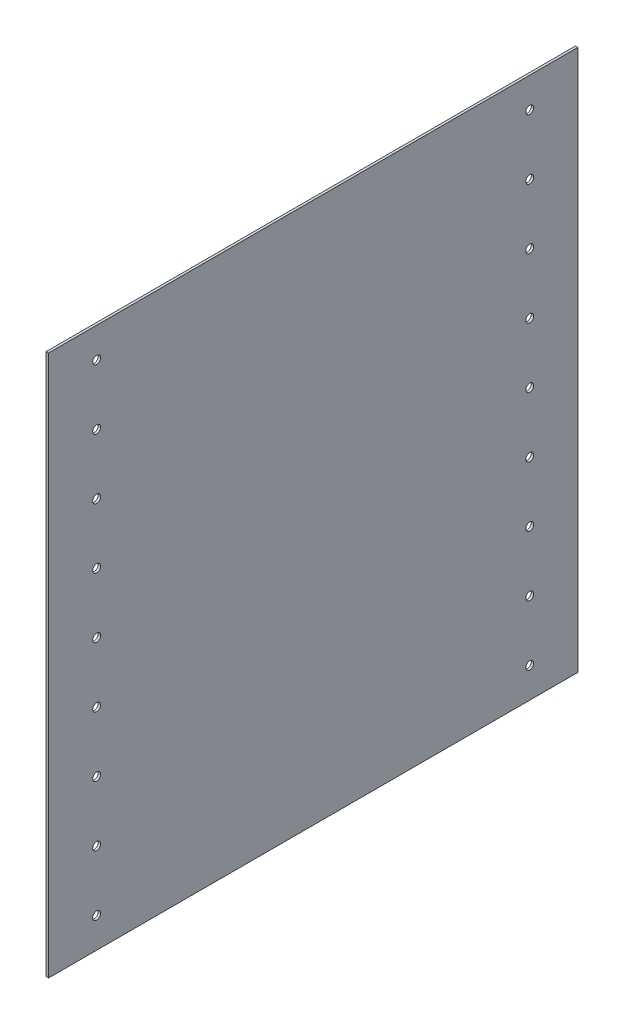
ISO-10303-21;
HEADER;
FILE_DESCRIPTION(('STEP AP214'),'2;1');
FILE_NAME('part.step','',(''),(''),'','','');
FILE_SCHEMA(('AUTOMOTIVE_DESIGN { 1 0 10303 214 1 1 1 1 }'));
ENDSEC;
DATA;
#1=APPLICATION_CONTEXT('core data for automotive mechanical design processes');
#2=APPLICATION_PROTOCOL_DEFINITION('international standard','automotive_design',2000,#1);
#3=PRODUCT_CONTEXT('',#1,'mechanical');
#4=PRODUCT('Part','Part','',(#3));
#5=PRODUCT_RELATED_PRODUCT_CATEGORY('part','',(#4));
#6=PRODUCT_DEFINITION_FORMATION('','',#4);
#7=PRODUCT_DEFINITION_CONTEXT('part definition',#1,'design');
#8=PRODUCT_DEFINITION('design','',#6,#7);
#9=PRODUCT_DEFINITION_SHAPE('','',#8);
#10=(LENGTH_UNIT() NAMED_UNIT(*) SI_UNIT(.MILLI.,.METRE.));
#11=(NAMED_UNIT(*) PLANE_ANGLE_UNIT() SI_UNIT($,.RADIAN.));
#12=(NAMED_UNIT(*) SI_UNIT($,.STERADIAN.) SOLID_ANGLE_UNIT());
#13=UNCERTAINTY_MEASURE_WITH_UNIT(LENGTH_MEASURE(1.E-05),#10,'distance_accuracy_value','');
#14=(GEOMETRIC_REPRESENTATION_CONTEXT(3) GLOBAL_UNCERTAINTY_ASSIGNED_CONTEXT((#13)) GLOBAL_UNIT_ASSIGNED_CONTEXT((#10,
#11,#12)) REPRESENTATION_CONTEXT('',''));
#15=CARTESIAN_POINT('',(0.,0.,0.));
#16=DIRECTION('',(0.,0.,1.));
#17=DIRECTION('',(1.,0.,0.));
#18=AXIS2_PLACEMENT_3D('',#15,#16,#17);
#19=CARTESIAN_POINT('',(2.,0.,440.));
#20=DIRECTION('',(-1.,0.,0.));
#21=DIRECTION('',(0.,0.,1.));
#22=AXIS2_PLACEMENT_3D('',#19,#20,#21);
#23=PLANE('',#22);
#24=CARTESIAN_POINT('',(2.,425.,400.));
#25=DIRECTION('',(1.,0.,0.));
#26=DIRECTION('',(0.,0.,-1.));
#27=AXIS2_PLACEMENT_3D('',#24,#25,#26);
#28=CIRCLE('',#27,3.30000000000003);
#29=CARTESIAN_POINT('',(2.,425.,396.7));
#30=VERTEX_POINT('',#29);
#31=EDGE_CURVE('E185',#30,#30,#28,.T.);
#32=ORIENTED_EDGE('',*,*,#31,.F.);
#33=EDGE_LOOP('',(#32));
#34=FACE_BOUND('',#33,.T.);
#35=DIRECTION('',(0.,1.,0.));
#36=VECTOR('',#35,1.);
#37=CARTESIAN_POINT('',(2.,0.,0.));
#38=LINE('',#37,#36);
#39=CARTESIAN_POINT('',(2.,0.,0.));
#40=VERTEX_POINT('',#39);
#41=CARTESIAN_POINT('',(2.,450.,0.));
#42=VERTEX_POINT('',#41);
#43=EDGE_CURVE('E102',#40,#42,#38,.T.);
#44=ORIENTED_EDGE('',*,*,#43,.T.);
#45=DIRECTION('',(0.,0.,-1.));
#46=VECTOR('',#45,1.);
#47=CARTESIAN_POINT('',(2.,450.,440.));
#48=LINE('',#47,#46);
#49=CARTESIAN_POINT('',(2.,450.,440.));
#50=VERTEX_POINT('',#49);
#51=EDGE_CURVE('E11',#50,#42,#48,.T.);
#52=ORIENTED_EDGE('',*,*,#51,.F.);
#53=DIRECTION('',(0.,1.,0.));
#54=VECTOR('',#53,1.);
#55=CARTESIAN_POINT('',(2.,0.,440.));
#56=LINE('',#55,#54);
#57=CARTESIAN_POINT('',(2.,0.,440.));
#58=VERTEX_POINT('',#57);
#59=EDGE_CURVE('E78',#58,#50,#56,.T.);
#60=ORIENTED_EDGE('',*,*,#59,.F.);
#61=DIRECTION('',(0.,0.,-1.));
#62=VECTOR('',#61,1.);
#63=CARTESIAN_POINT('',(2.,0.,440.));
#64=LINE('',#63,#62);
#65=EDGE_CURVE('E54',#58,#40,#64,.T.);
#66=ORIENTED_EDGE('',*,*,#65,.T.);
#67=EDGE_LOOP('',(#44,#52,#60,#66));
#68=FACE_BOUND('',#67,.T.);
#69=CARTESIAN_POINT('',(2.,425.,40.));
#70=DIRECTION('',(1.,0.,0.));
#71=DIRECTION('',(0.,0.,-1.));
#72=AXIS2_PLACEMENT_3D('',#69,#70,#71);
#73=CIRCLE('',#72,3.30000000000003);
#74=CARTESIAN_POINT('',(2.,425.,36.7));
#75=VERTEX_POINT('',#74);
#76=EDGE_CURVE('E116',#75,#75,#73,.T.);
#77=ORIENTED_EDGE('',*,*,#76,.F.);
#78=EDGE_LOOP('',(#77));
#79=FACE_BOUND('',#78,.T.);
#80=CARTESIAN_POINT('',(2.,375.,40.0000000000005));
#81=DIRECTION('',(1.,0.,0.));
#82=DIRECTION('',(0.,0.,-1.));
#83=AXIS2_PLACEMENT_3D('',#80,#81,#82);
#84=CIRCLE('',#83,3.30000000000003);
#85=CARTESIAN_POINT('',(2.,375.,36.7000000000005));
#86=VERTEX_POINT('',#85);
#87=EDGE_CURVE('E117',#86,#86,#84,.T.);
#88=ORIENTED_EDGE('',*,*,#87,.F.);
#89=EDGE_LOOP('',(#88));
#90=FACE_BOUND('',#89,.T.);
#91=CARTESIAN_POINT('',(2.,325.,40.0000000000009));
#92=DIRECTION('',(1.,0.,0.));
#93=DIRECTION('',(0.,0.,-1.));
#94=AXIS2_PLACEMENT_3D('',#91,#92,#93);
#95=CIRCLE('',#94,3.30000000000003);
#96=CARTESIAN_POINT('',(2.,325.,36.7000000000009));
#97=VERTEX_POINT('',#96);
#98=EDGE_CURVE('E121',#97,#97,#95,.T.);
#99=ORIENTED_EDGE('',*,*,#98,.F.);
#100=EDGE_LOOP('',(#99));
#101=FACE_BOUND('',#100,.T.);
#102=CARTESIAN_POINT('',(2.,275.,40.0000000000014));
#103=DIRECTION('',(1.,0.,0.));
#104=DIRECTION('',(0.,0.,-1.));
#105=AXIS2_PLACEMENT_3D('',#102,#103,#104);
#106=CIRCLE('',#105,3.30000000000003);
#107=CARTESIAN_POINT('',(2.,275.,36.7000000000014));
#108=VERTEX_POINT('',#107);
#109=EDGE_CURVE('E125',#108,#108,#106,.T.);
#110=ORIENTED_EDGE('',*,*,#109,.F.);
#111=EDGE_LOOP('',(#110));
#112=FACE_BOUND('',#111,.T.);
#113=CARTESIAN_POINT('',(2.,225.,40.0000000000019));
#114=DIRECTION('',(1.,0.,0.));
#115=DIRECTION('',(0.,0.,-1.));
#116=AXIS2_PLACEMENT_3D('',#113,#114,#115);
#117=CIRCLE('',#116,3.3);
#118=CARTESIAN_POINT('',(2.,225.,36.7000000000019));
#119=VERTEX_POINT('',#118);
#120=EDGE_CURVE('E129',#119,#119,#117,.T.);
#121=ORIENTED_EDGE('',*,*,#120,.F.);
#122=EDGE_LOOP('',(#121));
#123=FACE_BOUND('',#122,.T.);
#124=CARTESIAN_POINT('',(2.,175.,40.0000000000024));
#125=DIRECTION('',(1.,0.,0.));
#126=DIRECTION('',(0.,0.,-1.));
#127=AXIS2_PLACEMENT_3D('',#124,#125,#126);
#128=CIRCLE('',#127,3.3);
#129=CARTESIAN_POINT('',(2.,175.,36.7000000000024));
#130=VERTEX_POINT('',#129);
#131=EDGE_CURVE('E133',#130,#130,#128,.T.);
#132=ORIENTED_EDGE('',*,*,#131,.F.);
#133=EDGE_LOOP('',(#132));
#134=FACE_BOUND('',#133,.T.);
#135=CARTESIAN_POINT('',(2.,125.,40.0000000000029));
#136=DIRECTION('',(1.,0.,0.));
#137=DIRECTION('',(0.,0.,-1.));
#138=AXIS2_PLACEMENT_3D('',#135,#136,#137);
#139=CIRCLE('',#138,3.3);
#140=CARTESIAN_POINT('',(2.,125.,36.7000000000029));
#141=VERTEX_POINT('',#140);
#142=EDGE_CURVE('E137',#141,#141,#139,.T.);
#143=ORIENTED_EDGE('',*,*,#142,.F.);
#144=EDGE_LOOP('',(#143));
#145=FACE_BOUND('',#144,.T.);
#146=CARTESIAN_POINT('',(2.,75.0000000000001,40.0000000000034));
#147=DIRECTION('',(1.,0.,0.));
#148=DIRECTION('',(0.,0.,-1.));
#149=AXIS2_PLACEMENT_3D('',#146,#147,#148);
#150=CIRCLE('',#149,3.3);
#151=CARTESIAN_POINT('',(2.,75.0000000000001,36.7000000000034));
#152=VERTEX_POINT('',#151);
#153=EDGE_CURVE('E141',#152,#152,#150,.T.);
#154=ORIENTED_EDGE('',*,*,#153,.F.);
#155=EDGE_LOOP('',(#154));
#156=FACE_BOUND('',#155,.T.);
#157=CARTESIAN_POINT('',(2.,25.0000000000001,40.000000000004));
#158=DIRECTION('',(1.,0.,0.));
#159=DIRECTION('',(0.,0.,-1.));
#160=AXIS2_PLACEMENT_3D('',#157,#158,#159);
#161=CIRCLE('',#160,3.3);
#162=CARTESIAN_POINT('',(2.,25.0000000000001,36.700000000004));
#163=VERTEX_POINT('',#162);
#164=EDGE_CURVE('E145',#163,#163,#161,.T.);
#165=ORIENTED_EDGE('',*,*,#164,.F.);
#166=EDGE_LOOP('',(#165));
#167=FACE_BOUND('',#166,.T.);
#168=CARTESIAN_POINT('',(2.,25.0000000000001,399.999999999996));
#169=DIRECTION('',(1.,0.,0.));
#170=DIRECTION('',(0.,0.,-1.));
#171=AXIS2_PLACEMENT_3D('',#168,#169,#170);
#172=CIRCLE('',#171,3.3);
#173=CARTESIAN_POINT('',(2.,25.0000000000001,396.699999999996));
#174=VERTEX_POINT('',#173);
#175=EDGE_CURVE('E149',#174,#174,#172,.T.);
#176=ORIENTED_EDGE('',*,*,#175,.F.);
#177=EDGE_LOOP('',(#176));
#178=FACE_BOUND('',#177,.T.);
#179=CARTESIAN_POINT('',(2.,75.0000000000001,399.999999999997));
#180=DIRECTION('',(1.,0.,0.));
#181=DIRECTION('',(0.,0.,-1.));
#182=AXIS2_PLACEMENT_3D('',#179,#180,#181);
#183=CIRCLE('',#182,3.3);
#184=CARTESIAN_POINT('',(2.,75.0000000000001,396.699999999997));
#185=VERTEX_POINT('',#184);
#186=EDGE_CURVE('E153',#185,#185,#183,.T.);
#187=ORIENTED_EDGE('',*,*,#186,.F.);
#188=EDGE_LOOP('',(#187));
#189=FACE_BOUND('',#188,.T.);
#190=CARTESIAN_POINT('',(2.,125.,399.999999999997));
#191=DIRECTION('',(1.,0.,0.));
#192=DIRECTION('',(0.,0.,-1.));
#193=AXIS2_PLACEMENT_3D('',#190,#191,#192);
#194=CIRCLE('',#193,3.3);
#195=CARTESIAN_POINT('',(2.,125.,396.699999999997));
#196=VERTEX_POINT('',#195);
#197=EDGE_CURVE('E157',#196,#196,#194,.T.);
#198=ORIENTED_EDGE('',*,*,#197,.F.);
#199=EDGE_LOOP('',(#198));
#200=FACE_BOUND('',#199,.T.);
#201=CARTESIAN_POINT('',(2.,175.,399.999999999997));
#202=DIRECTION('',(1.,0.,0.));
#203=DIRECTION('',(0.,0.,-1.));
#204=AXIS2_PLACEMENT_3D('',#201,#202,#203);
#205=CIRCLE('',#204,3.3);
#206=CARTESIAN_POINT('',(2.,175.,396.699999999997));
#207=VERTEX_POINT('',#206);
#208=EDGE_CURVE('E161',#207,#207,#205,.T.);
#209=ORIENTED_EDGE('',*,*,#208,.F.);
#210=EDGE_LOOP('',(#209));
#211=FACE_BOUND('',#210,.T.);
#212=CARTESIAN_POINT('',(2.,225.,399.999999999998));
#213=DIRECTION('',(1.,0.,0.));
#214=DIRECTION('',(0.,0.,-1.));
#215=AXIS2_PLACEMENT_3D('',#212,#213,#214);
#216=CIRCLE('',#215,3.3);
#217=CARTESIAN_POINT('',(2.,225.,396.699999999998));
#218=VERTEX_POINT('',#217);
#219=EDGE_CURVE('E165',#218,#218,#216,.T.);
#220=ORIENTED_EDGE('',*,*,#219,.F.);
#221=EDGE_LOOP('',(#220));
#222=FACE_BOUND('',#221,.T.);
#223=CARTESIAN_POINT('',(2.,275.,399.999999999999));
#224=DIRECTION('',(1.,0.,0.));
#225=DIRECTION('',(0.,0.,-1.));
#226=AXIS2_PLACEMENT_3D('',#223,#224,#225);
#227=CIRCLE('',#226,3.30000000000003);
#228=CARTESIAN_POINT('',(2.,275.,396.699999999999));
#229=VERTEX_POINT('',#228);
#230=EDGE_CURVE('E169',#229,#229,#227,.T.);
#231=ORIENTED_EDGE('',*,*,#230,.F.);
#232=EDGE_LOOP('',(#231));
#233=FACE_BOUND('',#232,.T.);
#234=CARTESIAN_POINT('',(2.,325.,399.999999999999));
#235=DIRECTION('',(1.,0.,0.));
#236=DIRECTION('',(0.,0.,-1.));
#237=AXIS2_PLACEMENT_3D('',#234,#235,#236);
#238=CIRCLE('',#237,3.30000000000003);
#239=CARTESIAN_POINT('',(2.,325.,396.699999999999));
#240=VERTEX_POINT('',#239);
#241=EDGE_CURVE('E172',#240,#240,#238,.T.);
#242=ORIENTED_EDGE('',*,*,#241,.F.);
#243=EDGE_LOOP('',(#242));
#244=FACE_BOUND('',#243,.T.);
#245=CARTESIAN_POINT('',(2.,375.,400.));
#246=DIRECTION('',(1.,0.,0.));
#247=DIRECTION('',(0.,0.,-1.));
#248=AXIS2_PLACEMENT_3D('',#245,#246,#247);
#249=CIRCLE('',#248,3.30000000000003);
#250=CARTESIAN_POINT('',(2.,375.,396.699999999999));
#251=VERTEX_POINT('',#250);
#252=EDGE_CURVE('E175',#251,#251,#249,.T.);
#253=ORIENTED_EDGE('',*,*,#252,.F.);
#254=EDGE_LOOP('',(#253));
#255=FACE_BOUND('',#254,.T.);
#256=ADVANCED_FACE('F36',(#34,#68,#79,#90,#101,#112,#123,#134,#145,#156,#167,#178,#189,#200,
#211,#222,#233,#244,#255),#23,.F.);
#257=CARTESIAN_POINT('',(0.,450.,440.));
#258=DIRECTION('',(0.,1.,0.));
#259=DIRECTION('',(0.,0.,1.));
#260=AXIS2_PLACEMENT_3D('',#257,#258,#259);
#261=PLANE('',#260);
#262=DIRECTION('',(1.,0.,0.));
#263=VECTOR('',#262,1.);
#264=CARTESIAN_POINT('',(0.,450.,0.));
#265=LINE('',#264,#263);
#266=CARTESIAN_POINT('',(0.,450.,0.));
#267=VERTEX_POINT('',#266);
#268=EDGE_CURVE('E87',#267,#42,#265,.T.);
#269=ORIENTED_EDGE('',*,*,#268,.F.);
#270=DIRECTION('',(0.,0.,-1.));
#271=VECTOR('',#270,1.);
#272=CARTESIAN_POINT('',(0.,450.,440.));
#273=LINE('',#272,#271);
#274=CARTESIAN_POINT('',(0.,450.,440.));
#275=VERTEX_POINT('',#274);
#276=EDGE_CURVE('E45',#275,#267,#273,.T.);
#277=ORIENTED_EDGE('',*,*,#276,.F.);
#278=DIRECTION('',(1.,0.,0.));
#279=VECTOR('',#278,1.);
#280=CARTESIAN_POINT('',(0.,450.,440.));
#281=LINE('',#280,#279);
#282=EDGE_CURVE('E85',#275,#50,#281,.T.);
#283=ORIENTED_EDGE('',*,*,#282,.T.);
#284=ORIENTED_EDGE('',*,*,#51,.T.);
#285=EDGE_LOOP('',(#269,#277,#283,#284));
#286=FACE_BOUND('',#285,.T.);
#287=ADVANCED_FACE('F84',(#286),#261,.T.);
#288=CARTESIAN_POINT('',(0.,0.,440.));
#289=DIRECTION('',(-1.,0.,0.));
#290=DIRECTION('',(0.,0.,1.));
#291=AXIS2_PLACEMENT_3D('',#288,#289,#290);
#292=PLANE('',#291);
#293=CARTESIAN_POINT('',(0.,425.,400.));
#294=DIRECTION('',(-1.,0.,0.));
#295=DIRECTION('',(0.,0.,1.));
#296=AXIS2_PLACEMENT_3D('',#293,#294,#295);
#297=CIRCLE('',#296,3.30000000000003);
#298=CARTESIAN_POINT('',(0.,425.,403.3));
#299=VERTEX_POINT('',#298);
#300=EDGE_CURVE('E39',#299,#299,#297,.T.);
#301=ORIENTED_EDGE('',*,*,#300,.F.);
#302=EDGE_LOOP('',(#301));
#303=FACE_BOUND('',#302,.T.);
#304=CARTESIAN_POINT('',(0.,375.,400.));
#305=DIRECTION('',(-1.,0.,0.));
#306=DIRECTION('',(0.,0.,1.));
#307=AXIS2_PLACEMENT_3D('',#304,#305,#306);
#308=CIRCLE('',#307,3.30000000000003);
#309=CARTESIAN_POINT('',(0.,375.,403.3));
#310=VERTEX_POINT('',#309);
#311=EDGE_CURVE('E173',#310,#310,#308,.T.);
#312=ORIENTED_EDGE('',*,*,#311,.F.);
#313=EDGE_LOOP('',(#312));
#314=FACE_BOUND('',#313,.T.);
#315=CARTESIAN_POINT('',(0.,325.,399.999999999999));
#316=DIRECTION('',(-1.,0.,0.));
#317=DIRECTION('',(0.,0.,1.));
#318=AXIS2_PLACEMENT_3D('',#315,#316,#317);
#319=CIRCLE('',#318,3.30000000000003);
#320=CARTESIAN_POINT('',(0.,325.,403.299999999999));
#321=VERTEX_POINT('',#320);
#322=EDGE_CURVE('E170',#321,#321,#319,.T.);
#323=ORIENTED_EDGE('',*,*,#322,.F.);
#324=EDGE_LOOP('',(#323));
#325=FACE_BOUND('',#324,.T.);
#326=CARTESIAN_POINT('',(0.,275.,399.999999999999));
#327=DIRECTION('',(-1.,0.,0.));
#328=DIRECTION('',(0.,0.,1.));
#329=AXIS2_PLACEMENT_3D('',#326,#327,#328);
#330=CIRCLE('',#329,3.30000000000003);
#331=CARTESIAN_POINT('',(0.,275.,403.299999999999));
#332=VERTEX_POINT('',#331);
#333=EDGE_CURVE('E166',#332,#332,#330,.T.);
#334=ORIENTED_EDGE('',*,*,#333,.F.);
#335=EDGE_LOOP('',(#334));
#336=FACE_BOUND('',#335,.T.);
#337=CARTESIAN_POINT('',(0.,225.,399.999999999998));
#338=DIRECTION('',(-1.,0.,0.));
#339=DIRECTION('',(0.,0.,1.));
#340=AXIS2_PLACEMENT_3D('',#337,#338,#339);
#341=CIRCLE('',#340,3.3);
#342=CARTESIAN_POINT('',(0.,225.,403.299999999998));
#343=VERTEX_POINT('',#342);
#344=EDGE_CURVE('E162',#343,#343,#341,.T.);
#345=ORIENTED_EDGE('',*,*,#344,.F.);
#346=EDGE_LOOP('',(#345));
#347=FACE_BOUND('',#346,.T.);
#348=CARTESIAN_POINT('',(0.,175.,399.999999999997));
#349=DIRECTION('',(-1.,0.,0.));
#350=DIRECTION('',(0.,0.,1.));
#351=AXIS2_PLACEMENT_3D('',#348,#349,#350);
#352=CIRCLE('',#351,3.3);
#353=CARTESIAN_POINT('',(0.,175.,403.299999999998));
#354=VERTEX_POINT('',#353);
#355=EDGE_CURVE('E158',#354,#354,#352,.T.);
#356=ORIENTED_EDGE('',*,*,#355,.F.);
#357=EDGE_LOOP('',(#356));
#358=FACE_BOUND('',#357,.T.);
#359=CARTESIAN_POINT('',(0.,125.,399.999999999997));
#360=DIRECTION('',(-1.,0.,0.));
#361=DIRECTION('',(0.,0.,1.));
#362=AXIS2_PLACEMENT_3D('',#359,#360,#361);
#363=CIRCLE('',#362,3.3);
#364=CARTESIAN_POINT('',(0.,125.,403.299999999997));
#365=VERTEX_POINT('',#364);
#366=EDGE_CURVE('E154',#365,#365,#363,.T.);
#367=ORIENTED_EDGE('',*,*,#366,.F.);
#368=EDGE_LOOP('',(#367));
#369=FACE_BOUND('',#368,.T.);
#370=CARTESIAN_POINT('',(0.,75.0000000000001,399.999999999997));
#371=DIRECTION('',(-1.,0.,0.));
#372=DIRECTION('',(0.,0.,1.));
#373=AXIS2_PLACEMENT_3D('',#370,#371,#372);
#374=CIRCLE('',#373,3.3);
#375=CARTESIAN_POINT('',(0.,75.0000000000001,403.299999999997));
#376=VERTEX_POINT('',#375);
#377=EDGE_CURVE('E150',#376,#376,#374,.T.);
#378=ORIENTED_EDGE('',*,*,#377,.F.);
#379=EDGE_LOOP('',(#378));
#380=FACE_BOUND('',#379,.T.);
#381=CARTESIAN_POINT('',(0.,25.0000000000001,399.999999999996));
#382=DIRECTION('',(-1.,0.,0.));
#383=DIRECTION('',(0.,0.,1.));
#384=AXIS2_PLACEMENT_3D('',#381,#382,#383);
#385=CIRCLE('',#384,3.3);
#386=CARTESIAN_POINT('',(0.,25.0000000000001,403.299999999996));
#387=VERTEX_POINT('',#386);
#388=EDGE_CURVE('E146',#387,#387,#385,.T.);
#389=ORIENTED_EDGE('',*,*,#388,.F.);
#390=EDGE_LOOP('',(#389));
#391=FACE_BOUND('',#390,.T.);
#392=CARTESIAN_POINT('',(0.,25.0000000000001,40.000000000004));
#393=DIRECTION('',(-1.,0.,0.));
#394=DIRECTION('',(0.,0.,1.));
#395=AXIS2_PLACEMENT_3D('',#392,#393,#394);
#396=CIRCLE('',#395,3.3);
#397=CARTESIAN_POINT('',(0.,25.0000000000001,43.300000000004));
#398=VERTEX_POINT('',#397);
#399=EDGE_CURVE('E142',#398,#398,#396,.T.);
#400=ORIENTED_EDGE('',*,*,#399,.F.);
#401=EDGE_LOOP('',(#400));
#402=FACE_BOUND('',#401,.T.);
#403=CARTESIAN_POINT('',(0.,75.0000000000001,40.0000000000034));
#404=DIRECTION('',(-1.,0.,0.));
#405=DIRECTION('',(0.,0.,1.));
#406=AXIS2_PLACEMENT_3D('',#403,#404,#405);
#407=CIRCLE('',#406,3.3);
#408=CARTESIAN_POINT('',(0.,75.0000000000001,43.3000000000034));
#409=VERTEX_POINT('',#408);
#410=EDGE_CURVE('E138',#409,#409,#407,.T.);
#411=ORIENTED_EDGE('',*,*,#410,.F.);
#412=EDGE_LOOP('',(#411));
#413=FACE_BOUND('',#412,.T.);
#414=CARTESIAN_POINT('',(0.,125.,40.0000000000029));
#415=DIRECTION('',(-1.,0.,0.));
#416=DIRECTION('',(0.,0.,1.));
#417=AXIS2_PLACEMENT_3D('',#414,#415,#416);
#418=CIRCLE('',#417,3.3);
#419=CARTESIAN_POINT('',(0.,125.,43.3000000000029));
#420=VERTEX_POINT('',#419);
#421=EDGE_CURVE('E134',#420,#420,#418,.T.);
#422=ORIENTED_EDGE('',*,*,#421,.F.);
#423=EDGE_LOOP('',(#422));
#424=FACE_BOUND('',#423,.T.);
#425=CARTESIAN_POINT('',(0.,175.,40.0000000000024));
#426=DIRECTION('',(-1.,0.,0.));
#427=DIRECTION('',(0.,0.,1.));
#428=AXIS2_PLACEMENT_3D('',#425,#426,#427);
#429=CIRCLE('',#428,3.3);
#430=CARTESIAN_POINT('',(0.,175.,43.3000000000024));
#431=VERTEX_POINT('',#430);
#432=EDGE_CURVE('E130',#431,#431,#429,.T.);
#433=ORIENTED_EDGE('',*,*,#432,.F.);
#434=EDGE_LOOP('',(#433));
#435=FACE_BOUND('',#434,.T.);
#436=CARTESIAN_POINT('',(0.,225.,40.0000000000019));
#437=DIRECTION('',(-1.,0.,0.));
#438=DIRECTION('',(0.,0.,1.));
#439=AXIS2_PLACEMENT_3D('',#436,#437,#438);
#440=CIRCLE('',#439,3.3);
#441=CARTESIAN_POINT('',(0.,225.,43.3000000000019));
#442=VERTEX_POINT('',#441);
#443=EDGE_CURVE('E126',#442,#442,#440,.T.);
#444=ORIENTED_EDGE('',*,*,#443,.F.);
#445=EDGE_LOOP('',(#444));
#446=FACE_BOUND('',#445,.T.);
#447=CARTESIAN_POINT('',(0.,275.,40.0000000000014));
#448=DIRECTION('',(-1.,0.,0.));
#449=DIRECTION('',(0.,0.,1.));
#450=AXIS2_PLACEMENT_3D('',#447,#448,#449);
#451=CIRCLE('',#450,3.30000000000003);
#452=CARTESIAN_POINT('',(0.,275.,43.3000000000014));
#453=VERTEX_POINT('',#452);
#454=EDGE_CURVE('E122',#453,#453,#451,.T.);
#455=ORIENTED_EDGE('',*,*,#454,.F.);
#456=EDGE_LOOP('',(#455));
#457=FACE_BOUND('',#456,.T.);
#458=CARTESIAN_POINT('',(0.,325.,40.0000000000009));
#459=DIRECTION('',(-1.,0.,0.));
#460=DIRECTION('',(0.,0.,1.));
#461=AXIS2_PLACEMENT_3D('',#458,#459,#460);
#462=CIRCLE('',#461,3.30000000000003);
#463=CARTESIAN_POINT('',(0.,325.,43.3000000000009));
#464=VERTEX_POINT('',#463);
#465=EDGE_CURVE('E118',#464,#464,#462,.T.);
#466=ORIENTED_EDGE('',*,*,#465,.F.);
#467=EDGE_LOOP('',(#466));
#468=FACE_BOUND('',#467,.T.);
#469=CARTESIAN_POINT('',(0.,375.,40.0000000000005));
#470=DIRECTION('',(-1.,0.,0.));
#471=DIRECTION('',(0.,0.,1.));
#472=AXIS2_PLACEMENT_3D('',#469,#470,#471);
#473=CIRCLE('',#472,3.30000000000003);
#474=CARTESIAN_POINT('',(0.,375.,43.3000000000005));
#475=VERTEX_POINT('',#474);
#476=EDGE_CURVE('E113',#475,#475,#473,.T.);
#477=ORIENTED_EDGE('',*,*,#476,.F.);
#478=EDGE_LOOP('',(#477));
#479=FACE_BOUND('',#478,.T.);
#480=CARTESIAN_POINT('',(0.,425.,40.));
#481=DIRECTION('',(-1.,0.,0.));
#482=DIRECTION('',(0.,0.,1.));
#483=AXIS2_PLACEMENT_3D('',#480,#481,#482);
#484=CIRCLE('',#483,3.30000000000003);
#485=CARTESIAN_POINT('',(0.,425.,43.3));
#486=VERTEX_POINT('',#485);
#487=EDGE_CURVE('E104',#486,#486,#484,.T.);
#488=ORIENTED_EDGE('',*,*,#487,.F.);
#489=EDGE_LOOP('',(#488));
#490=FACE_BOUND('',#489,.T.);
#491=DIRECTION('',(0.,1.,0.));
#492=VECTOR('',#491,1.);
#493=CARTESIAN_POINT('',(0.,0.,0.));
#494=LINE('',#493,#492);
#495=CARTESIAN_POINT('',(0.,0.,0.));
#496=VERTEX_POINT('',#495);
#497=EDGE_CURVE('E106',#496,#267,#494,.T.);
#498=ORIENTED_EDGE('',*,*,#497,.F.);
#499=DIRECTION('',(0.,0.,-1.));
#500=VECTOR('',#499,1.);
#501=CARTESIAN_POINT('',(0.,0.,440.));
#502=LINE('',#501,#500);
#503=CARTESIAN_POINT('',(0.,0.,440.));
#504=VERTEX_POINT('',#503);
#505=EDGE_CURVE('E67',#504,#496,#502,.T.);
#506=ORIENTED_EDGE('',*,*,#505,.F.);
#507=DIRECTION('',(0.,1.,0.));
#508=VECTOR('',#507,1.);
#509=CARTESIAN_POINT('',(0.,0.,440.));
#510=LINE('',#509,#508);
#511=EDGE_CURVE('E94',#504,#275,#510,.T.);
#512=ORIENTED_EDGE('',*,*,#511,.T.);
#513=ORIENTED_EDGE('',*,*,#276,.T.);
#514=EDGE_LOOP('',(#498,#506,#512,#513));
#515=FACE_BOUND('',#514,.T.);
#516=ADVANCED_FACE('F96',(#303,#314,#325,#336,#347,#358,#369,#380,#391,#402,#413,#424,#435,#446,
#457,#468,#479,#490,#515),#292,.T.);
#517=CARTESIAN_POINT('',(2.,0.,440.));
#518=DIRECTION('',(0.,-1.,0.));
#519=DIRECTION('',(0.,0.,-1.));
#520=AXIS2_PLACEMENT_3D('',#517,#518,#519);
#521=PLANE('',#520);
#522=DIRECTION('',(-1.,0.,0.));
#523=VECTOR('',#522,1.);
#524=CARTESIAN_POINT('',(2.,0.,0.));
#525=LINE('',#524,#523);
#526=EDGE_CURVE('E108',#40,#496,#525,.T.);
#527=ORIENTED_EDGE('',*,*,#526,.F.);
#528=ORIENTED_EDGE('',*,*,#65,.F.);
#529=DIRECTION('',(-1.,0.,0.));
#530=VECTOR('',#529,1.);
#531=CARTESIAN_POINT('',(2.,0.,440.));
#532=LINE('',#531,#530);
#533=EDGE_CURVE('E97',#58,#504,#532,.T.);
#534=ORIENTED_EDGE('',*,*,#533,.T.);
#535=ORIENTED_EDGE('',*,*,#505,.T.);
#536=EDGE_LOOP('',(#527,#528,#534,#535));
#537=FACE_BOUND('',#536,.T.);
#538=ADVANCED_FACE('F225',(#537),#521,.T.);
#539=CARTESIAN_POINT('',(2.,450.,440.));
#540=DIRECTION('',(0.,0.,-1.));
#541=DIRECTION('',(-1.,0.,0.));
#542=AXIS2_PLACEMENT_3D('',#539,#540,#541);
#543=PLANE('',#542);
#544=ORIENTED_EDGE('',*,*,#59,.T.);
#545=ORIENTED_EDGE('',*,*,#282,.F.);
#546=ORIENTED_EDGE('',*,*,#511,.F.);
#547=ORIENTED_EDGE('',*,*,#533,.F.);
#548=EDGE_LOOP('',(#544,#545,#546,#547));
#549=FACE_BOUND('',#548,.T.);
#550=ADVANCED_FACE('F93',(#549),#543,.F.);
#551=CARTESIAN_POINT('',(2.,450.,0.));
#552=DIRECTION('',(0.,0.,-1.));
#553=DIRECTION('',(-1.,0.,0.));
#554=AXIS2_PLACEMENT_3D('',#551,#552,#553);
#555=PLANE('',#554);
#556=ORIENTED_EDGE('',*,*,#43,.F.);
#557=ORIENTED_EDGE('',*,*,#526,.T.);
#558=ORIENTED_EDGE('',*,*,#497,.T.);
#559=ORIENTED_EDGE('',*,*,#268,.T.);
#560=EDGE_LOOP('',(#556,#557,#558,#559));
#561=FACE_BOUND('',#560,.T.);
#562=ADVANCED_FACE('F345',(#561),#555,.T.);
#563=CARTESIAN_POINT('',(2.,425.,40.));
#564=DIRECTION('',(1.,0.,0.));
#565=DIRECTION('',(0.,0.,-1.));
#566=AXIS2_PLACEMENT_3D('',#563,#564,#565);
#567=CYLINDRICAL_SURFACE('',#566,3.30000000000003);
#568=ORIENTED_EDGE('',*,*,#487,.T.);
#569=EDGE_LOOP('',(#568));
#570=FACE_BOUND('',#569,.T.);
#571=ORIENTED_EDGE('',*,*,#76,.T.);
#572=EDGE_LOOP('',(#571));
#573=FACE_BOUND('',#572,.T.);
#574=ADVANCED_FACE('F221',(#570,#573),#567,.F.);
#575=CARTESIAN_POINT('',(2.,375.,40.0000000000005));
#576=DIRECTION('',(1.,0.,0.));
#577=DIRECTION('',(0.,0.,-1.));
#578=AXIS2_PLACEMENT_3D('',#575,#576,#577);
#579=CYLINDRICAL_SURFACE('',#578,3.30000000000003);
#580=ORIENTED_EDGE('',*,*,#476,.T.);
#581=EDGE_LOOP('',(#580));
#582=FACE_BOUND('',#581,.T.);
#583=ORIENTED_EDGE('',*,*,#87,.T.);
#584=EDGE_LOOP('',(#583));
#585=FACE_BOUND('',#584,.T.);
#586=ADVANCED_FACE('F338',(#582,#585),#579,.F.);
#587=CARTESIAN_POINT('',(2.,325.,40.0000000000009));
#588=DIRECTION('',(1.,0.,0.));
#589=DIRECTION('',(0.,0.,-1.));
#590=AXIS2_PLACEMENT_3D('',#587,#588,#589);
#591=CYLINDRICAL_SURFACE('',#590,3.30000000000003);
#592=ORIENTED_EDGE('',*,*,#465,.T.);
#593=EDGE_LOOP('',(#592));
#594=FACE_BOUND('',#593,.T.);
#595=ORIENTED_EDGE('',*,*,#98,.T.);
#596=EDGE_LOOP('',(#595));
#597=FACE_BOUND('',#596,.T.);
#598=ADVANCED_FACE('F334',(#594,#597),#591,.F.);
#599=CARTESIAN_POINT('',(2.,275.,40.0000000000014));
#600=DIRECTION('',(1.,0.,0.));
#601=DIRECTION('',(0.,0.,-1.));
#602=AXIS2_PLACEMENT_3D('',#599,#600,#601);
#603=CYLINDRICAL_SURFACE('',#602,3.30000000000003);
#604=ORIENTED_EDGE('',*,*,#454,.T.);
#605=EDGE_LOOP('',(#604));
#606=FACE_BOUND('',#605,.T.);
#607=ORIENTED_EDGE('',*,*,#109,.T.);
#608=EDGE_LOOP('',(#607));
#609=FACE_BOUND('',#608,.T.);
#610=ADVANCED_FACE('F330',(#606,#609),#603,.F.);
#611=CARTESIAN_POINT('',(2.,225.,40.0000000000019));
#612=DIRECTION('',(1.,0.,0.));
#613=DIRECTION('',(0.,0.,-1.));
#614=AXIS2_PLACEMENT_3D('',#611,#612,#613);
#615=CYLINDRICAL_SURFACE('',#614,3.3);
#616=ORIENTED_EDGE('',*,*,#443,.T.);
#617=EDGE_LOOP('',(#616));
#618=FACE_BOUND('',#617,.T.);
#619=ORIENTED_EDGE('',*,*,#120,.T.);
#620=EDGE_LOOP('',(#619));
#621=FACE_BOUND('',#620,.T.);
#622=ADVANCED_FACE('F326',(#618,#621),#615,.F.);
#623=CARTESIAN_POINT('',(2.,175.,40.0000000000024));
#624=DIRECTION('',(1.,0.,0.));
#625=DIRECTION('',(0.,0.,-1.));
#626=AXIS2_PLACEMENT_3D('',#623,#624,#625);
#627=CYLINDRICAL_SURFACE('',#626,3.3);
#628=ORIENTED_EDGE('',*,*,#432,.T.);
#629=EDGE_LOOP('',(#628));
#630=FACE_BOUND('',#629,.T.);
#631=ORIENTED_EDGE('',*,*,#131,.T.);
#632=EDGE_LOOP('',(#631));
#633=FACE_BOUND('',#632,.T.);
#634=ADVANCED_FACE('F322',(#630,#633),#627,.F.);
#635=CARTESIAN_POINT('',(2.,125.,40.0000000000029));
#636=DIRECTION('',(1.,0.,0.));
#637=DIRECTION('',(0.,0.,-1.));
#638=AXIS2_PLACEMENT_3D('',#635,#636,#637);
#639=CYLINDRICAL_SURFACE('',#638,3.3);
#640=ORIENTED_EDGE('',*,*,#421,.T.);
#641=EDGE_LOOP('',(#640));
#642=FACE_BOUND('',#641,.T.);
#643=ORIENTED_EDGE('',*,*,#142,.T.);
#644=EDGE_LOOP('',(#643));
#645=FACE_BOUND('',#644,.T.);
#646=ADVANCED_FACE('F318',(#642,#645),#639,.F.);
#647=CARTESIAN_POINT('',(2.,75.0000000000001,40.0000000000034));
#648=DIRECTION('',(1.,0.,0.));
#649=DIRECTION('',(0.,0.,-1.));
#650=AXIS2_PLACEMENT_3D('',#647,#648,#649);
#651=CYLINDRICAL_SURFACE('',#650,3.3);
#652=ORIENTED_EDGE('',*,*,#410,.T.);
#653=EDGE_LOOP('',(#652));
#654=FACE_BOUND('',#653,.T.);
#655=ORIENTED_EDGE('',*,*,#153,.T.);
#656=EDGE_LOOP('',(#655));
#657=FACE_BOUND('',#656,.T.);
#658=ADVANCED_FACE('F314',(#654,#657),#651,.F.);
#659=CARTESIAN_POINT('',(2.,25.0000000000001,40.000000000004));
#660=DIRECTION('',(1.,0.,0.));
#661=DIRECTION('',(0.,0.,-1.));
#662=AXIS2_PLACEMENT_3D('',#659,#660,#661);
#663=CYLINDRICAL_SURFACE('',#662,3.3);
#664=ORIENTED_EDGE('',*,*,#399,.T.);
#665=EDGE_LOOP('',(#664));
#666=FACE_BOUND('',#665,.T.);
#667=ORIENTED_EDGE('',*,*,#164,.T.);
#668=EDGE_LOOP('',(#667));
#669=FACE_BOUND('',#668,.T.);
#670=ADVANCED_FACE('F310',(#666,#669),#663,.F.);
#671=CARTESIAN_POINT('',(2.,25.0000000000001,399.999999999996));
#672=DIRECTION('',(1.,0.,0.));
#673=DIRECTION('',(0.,0.,-1.));
#674=AXIS2_PLACEMENT_3D('',#671,#672,#673);
#675=CYLINDRICAL_SURFACE('',#674,3.3);
#676=ORIENTED_EDGE('',*,*,#388,.T.);
#677=EDGE_LOOP('',(#676));
#678=FACE_BOUND('',#677,.T.);
#679=ORIENTED_EDGE('',*,*,#175,.T.);
#680=EDGE_LOOP('',(#679));
#681=FACE_BOUND('',#680,.T.);
#682=ADVANCED_FACE('F306',(#678,#681),#675,.F.);
#683=CARTESIAN_POINT('',(2.,75.0000000000001,399.999999999997));
#684=DIRECTION('',(1.,0.,0.));
#685=DIRECTION('',(0.,0.,-1.));
#686=AXIS2_PLACEMENT_3D('',#683,#684,#685);
#687=CYLINDRICAL_SURFACE('',#686,3.3);
#688=ORIENTED_EDGE('',*,*,#377,.T.);
#689=EDGE_LOOP('',(#688));
#690=FACE_BOUND('',#689,.T.);
#691=ORIENTED_EDGE('',*,*,#186,.T.);
#692=EDGE_LOOP('',(#691));
#693=FACE_BOUND('',#692,.T.);
#694=ADVANCED_FACE('F302',(#690,#693),#687,.F.);
#695=CARTESIAN_POINT('',(2.,125.,399.999999999997));
#696=DIRECTION('',(1.,0.,0.));
#697=DIRECTION('',(0.,0.,-1.));
#698=AXIS2_PLACEMENT_3D('',#695,#696,#697);
#699=CYLINDRICAL_SURFACE('',#698,3.3);
#700=ORIENTED_EDGE('',*,*,#366,.T.);
#701=EDGE_LOOP('',(#700));
#702=FACE_BOUND('',#701,.T.);
#703=ORIENTED_EDGE('',*,*,#197,.T.);
#704=EDGE_LOOP('',(#703));
#705=FACE_BOUND('',#704,.T.);
#706=ADVANCED_FACE('F298',(#702,#705),#699,.F.);
#707=CARTESIAN_POINT('',(2.,175.,399.999999999997));
#708=DIRECTION('',(1.,0.,0.));
#709=DIRECTION('',(0.,0.,-1.));
#710=AXIS2_PLACEMENT_3D('',#707,#708,#709);
#711=CYLINDRICAL_SURFACE('',#710,3.3);
#712=ORIENTED_EDGE('',*,*,#355,.T.);
#713=EDGE_LOOP('',(#712));
#714=FACE_BOUND('',#713,.T.);
#715=ORIENTED_EDGE('',*,*,#208,.T.);
#716=EDGE_LOOP('',(#715));
#717=FACE_BOUND('',#716,.T.);
#718=ADVANCED_FACE('F294',(#714,#717),#711,.F.);
#719=CARTESIAN_POINT('',(2.,225.,399.999999999998));
#720=DIRECTION('',(1.,0.,0.));
#721=DIRECTION('',(0.,0.,-1.));
#722=AXIS2_PLACEMENT_3D('',#719,#720,#721);
#723=CYLINDRICAL_SURFACE('',#722,3.3);
#724=ORIENTED_EDGE('',*,*,#344,.T.);
#725=EDGE_LOOP('',(#724));
#726=FACE_BOUND('',#725,.T.);
#727=ORIENTED_EDGE('',*,*,#219,.T.);
#728=EDGE_LOOP('',(#727));
#729=FACE_BOUND('',#728,.T.);
#730=ADVANCED_FACE('F287',(#726,#729),#723,.F.);
#731=CARTESIAN_POINT('',(2.,275.,399.999999999999));
#732=DIRECTION('',(1.,0.,0.));
#733=DIRECTION('',(0.,0.,-1.));
#734=AXIS2_PLACEMENT_3D('',#731,#732,#733);
#735=CYLINDRICAL_SURFACE('',#734,3.30000000000003);
#736=ORIENTED_EDGE('',*,*,#333,.T.);
#737=EDGE_LOOP('',(#736));
#738=FACE_BOUND('',#737,.T.);
#739=ORIENTED_EDGE('',*,*,#230,.T.);
#740=EDGE_LOOP('',(#739));
#741=FACE_BOUND('',#740,.T.);
#742=ADVANCED_FACE('F278',(#738,#741),#735,.F.);
#743=CARTESIAN_POINT('',(2.,325.,399.999999999999));
#744=DIRECTION('',(1.,0.,0.));
#745=DIRECTION('',(0.,0.,-1.));
#746=AXIS2_PLACEMENT_3D('',#743,#744,#745);
#747=CYLINDRICAL_SURFACE('',#746,3.30000000000003);
#748=ORIENTED_EDGE('',*,*,#322,.T.);
#749=EDGE_LOOP('',(#748));
#750=FACE_BOUND('',#749,.T.);
#751=ORIENTED_EDGE('',*,*,#241,.T.);
#752=EDGE_LOOP('',(#751));
#753=FACE_BOUND('',#752,.T.);
#754=ADVANCED_FACE('F275',(#750,#753),#747,.F.);
#755=CARTESIAN_POINT('',(2.,375.,400.));
#756=DIRECTION('',(1.,0.,0.));
#757=DIRECTION('',(0.,0.,-1.));
#758=AXIS2_PLACEMENT_3D('',#755,#756,#757);
#759=CYLINDRICAL_SURFACE('',#758,3.30000000000003);
#760=ORIENTED_EDGE('',*,*,#311,.T.);
#761=EDGE_LOOP('',(#760));
#762=FACE_BOUND('',#761,.T.);
#763=ORIENTED_EDGE('',*,*,#252,.T.);
#764=EDGE_LOOP('',(#763));
#765=FACE_BOUND('',#764,.T.);
#766=ADVANCED_FACE('F277',(#762,#765),#759,.F.);
#767=CARTESIAN_POINT('',(2.,425.,400.));
#768=DIRECTION('',(1.,0.,0.));
#769=DIRECTION('',(0.,0.,-1.));
#770=AXIS2_PLACEMENT_3D('',#767,#768,#769);
#771=CYLINDRICAL_SURFACE('',#770,3.30000000000003);
#772=ORIENTED_EDGE('',*,*,#300,.T.);
#773=EDGE_LOOP('',(#772));
#774=FACE_BOUND('',#773,.T.);
#775=ORIENTED_EDGE('',*,*,#31,.T.);
#776=EDGE_LOOP('',(#775));
#777=FACE_BOUND('',#776,.T.);
#778=ADVANCED_FACE('F285',(#774,#777),#771,.F.);
#779=CLOSED_SHELL('',(#256,#287,#516,#538,#550,#562,#574,#586,#598,#610,#622,#634,#646,#658,
#670,#682,#694,#706,#718,#730,#742,#754,#766,#778));
#780=MANIFOLD_SOLID_BREP('B2',#779);
#781=ADVANCED_BREP_SHAPE_REPRESENTATION('',(#18,#780),#14);
#782=SHAPE_DEFINITION_REPRESENTATION(#9,#781);
ENDSEC;
END-ISO-10303-21;
